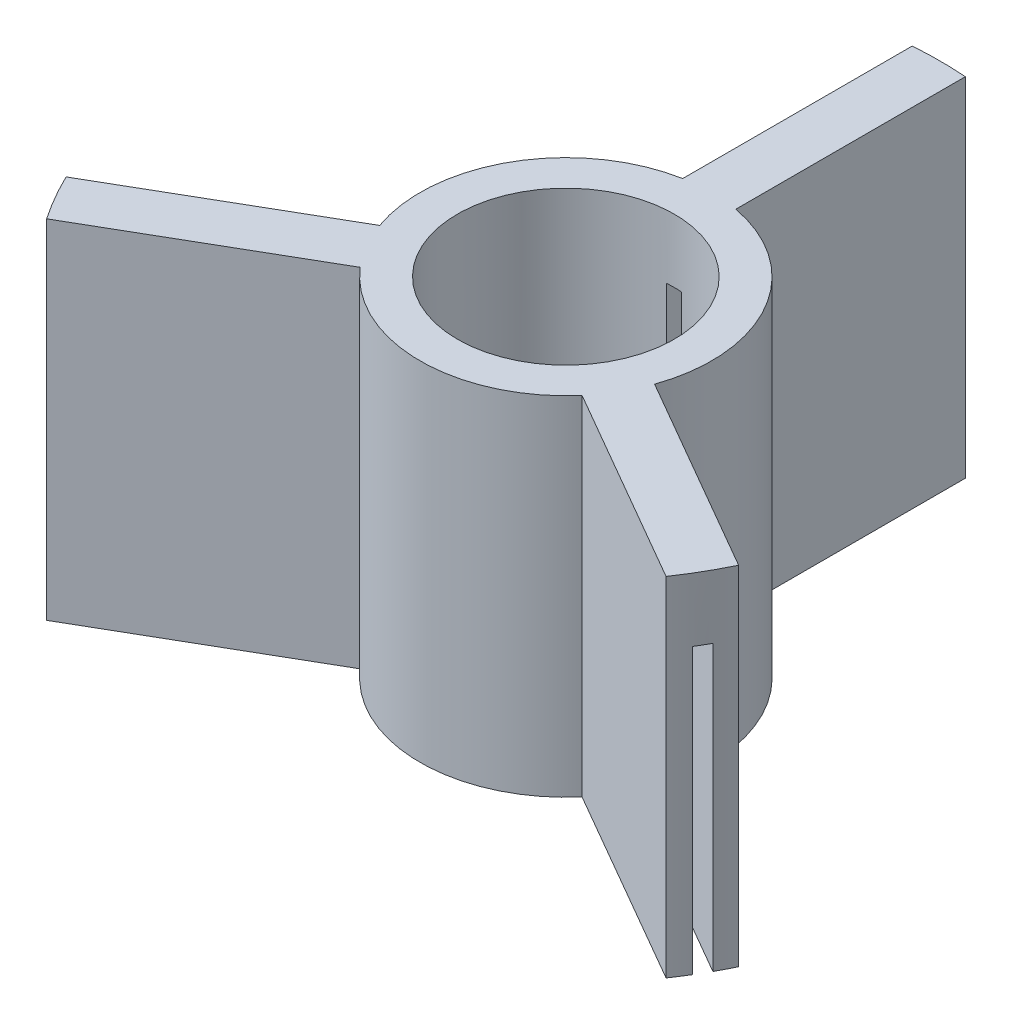
ISO-10303-21;
HEADER;
FILE_DESCRIPTION(('STEP AP214'),'2;1');
FILE_NAME('part.step','',(''),(''),'','','');
FILE_SCHEMA(('AUTOMOTIVE_DESIGN { 1 0 10303 214 1 1 1 1 }'));
ENDSEC;
DATA;
#1=APPLICATION_CONTEXT('core data for automotive mechanical design processes');
#2=APPLICATION_PROTOCOL_DEFINITION('international standard','automotive_design',2000,#1);
#3=PRODUCT_CONTEXT('',#1,'mechanical');
#4=PRODUCT('Part','Part','',(#3));
#5=PRODUCT_RELATED_PRODUCT_CATEGORY('part','',(#4));
#6=PRODUCT_DEFINITION_FORMATION('','',#4);
#7=PRODUCT_DEFINITION_CONTEXT('part definition',#1,'design');
#8=PRODUCT_DEFINITION('design','',#6,#7);
#9=PRODUCT_DEFINITION_SHAPE('','',#8);
#10=(LENGTH_UNIT() NAMED_UNIT(*) SI_UNIT(.MILLI.,.METRE.));
#11=(NAMED_UNIT(*) PLANE_ANGLE_UNIT() SI_UNIT($,.RADIAN.));
#12=(NAMED_UNIT(*) SI_UNIT($,.STERADIAN.) SOLID_ANGLE_UNIT());
#13=UNCERTAINTY_MEASURE_WITH_UNIT(LENGTH_MEASURE(1.E-05),#10,'distance_accuracy_value','');
#14=(GEOMETRIC_REPRESENTATION_CONTEXT(3) GLOBAL_UNCERTAINTY_ASSIGNED_CONTEXT((#13)) GLOBAL_UNIT_ASSIGNED_CONTEXT((#10,
#11,#12)) REPRESENTATION_CONTEXT('',''));
#15=CARTESIAN_POINT('',(0.,0.,0.));
#16=DIRECTION('',(0.,0.,1.));
#17=DIRECTION('',(1.,0.,0.));
#18=AXIS2_PLACEMENT_3D('',#15,#16,#17);
#19=CARTESIAN_POINT('',(0.,93.0000000000001,0.));
#20=DIRECTION('',(0.,-1.,0.));
#21=DIRECTION('',(0.,0.,-1.));
#22=AXIS2_PLACEMENT_3D('',#19,#20,#21);
#23=CYLINDRICAL_SURFACE('',#22,29.);
#24=CARTESIAN_POINT('',(0.,93.0000000000001,0.));
#25=DIRECTION('',(0.,1.,0.));
#26=DIRECTION('',(0.,0.,1.));
#27=AXIS2_PLACEMENT_3D('',#24,#25,#26);
#28=CIRCLE('',#27,29.);
#29=CARTESIAN_POINT('',(0.,93.0000000000001,29.));
#30=VERTEX_POINT('',#29);
#31=EDGE_CURVE('E331',#30,#30,#28,.T.);
#32=ORIENTED_EDGE('',*,*,#31,.T.);
#33=EDGE_LOOP('',(#32));
#34=FACE_BOUND('',#33,.T.);
#35=CARTESIAN_POINT('',(0.,76.0000000000001,0.));
#36=DIRECTION('',(0.,-1.,0.));
#37=DIRECTION('',(0.,0.,-1.));
#38=AXIS2_PLACEMENT_3D('',#35,#36,#37);
#39=CIRCLE('',#38,29.);
#40=CARTESIAN_POINT('',(26.0549396327351,76.0000000000001,12.7334253339205));
#41=VERTEX_POINT('',#40);
#42=CARTESIAN_POINT('',(24.0549396327351,76.0000000000001,16.1975269490583));
#43=VERTEX_POINT('',#42);
#44=EDGE_CURVE('E515',#41,#43,#39,.T.);
#45=ORIENTED_EDGE('',*,*,#44,.T.);
#46=DIRECTION('',(0.,-1.,0.));
#47=VECTOR('',#46,1.);
#48=CARTESIAN_POINT('',(24.0549396327351,93.0000000000001,16.1975269490583));
#49=LINE('',#48,#47);
#50=CARTESIAN_POINT('',(24.0549396327351,0.,16.1975269490583));
#51=VERTEX_POINT('',#50);
#52=EDGE_CURVE('E519',#43,#51,#49,.T.);
#53=ORIENTED_EDGE('',*,*,#52,.T.);
#54=CARTESIAN_POINT('',(0.,0.,0.));
#55=DIRECTION('',(0.,1.,0.));
#56=DIRECTION('',(0.,0.,1.));
#57=AXIS2_PLACEMENT_3D('',#54,#55,#56);
#58=CIRCLE('',#57,29.);
#59=CARTESIAN_POINT('',(-24.0549396327351,0.,16.1975269490583));
#60=VERTEX_POINT('',#59);
#61=EDGE_CURVE('E308',#60,#51,#58,.T.);
#62=ORIENTED_EDGE('',*,*,#61,.F.);
#63=DIRECTION('',(0.,-1.,0.));
#64=VECTOR('',#63,1.);
#65=CARTESIAN_POINT('',(-24.0549396327351,93.0000000000001,16.1975269490583));
#66=LINE('',#65,#64);
#67=CARTESIAN_POINT('',(-24.0549396327351,76.0000000000001,16.1975269490583));
#68=VERTEX_POINT('',#67);
#69=EDGE_CURVE('E134',#68,#60,#66,.T.);
#70=ORIENTED_EDGE('',*,*,#69,.F.);
#71=CARTESIAN_POINT('',(-26.0549396327351,76.0000000000001,12.7334253339206));
#72=VERTEX_POINT('',#71);
#73=EDGE_CURVE('E514',#68,#72,#39,.T.);
#74=ORIENTED_EDGE('',*,*,#73,.T.);
#75=DIRECTION('',(0.,-1.,0.));
#76=VECTOR('',#75,1.);
#77=CARTESIAN_POINT('',(-26.0549396327351,93.0000000000001,12.7334253339206));
#78=LINE('',#77,#76);
#79=CARTESIAN_POINT('',(-26.0549396327351,0.,12.7334253339206));
#80=VERTEX_POINT('',#79);
#81=EDGE_CURVE('E305',#72,#80,#78,.T.);
#82=ORIENTED_EDGE('',*,*,#81,.T.);
#83=CARTESIAN_POINT('',(-2.,0.,-28.9309522829789));
#84=VERTEX_POINT('',#83);
#85=EDGE_CURVE('E295',#84,#80,#58,.T.);
#86=ORIENTED_EDGE('',*,*,#85,.F.);
#87=DIRECTION('',(0.,-1.,0.));
#88=VECTOR('',#87,1.);
#89=CARTESIAN_POINT('',(-2.,93.0000000000001,-28.9309522829789));
#90=LINE('',#89,#88);
#91=CARTESIAN_POINT('',(-2.,76.0000000000001,-28.9309522829789));
#92=VERTEX_POINT('',#91);
#93=EDGE_CURVE('E279',#92,#84,#90,.T.);
#94=ORIENTED_EDGE('',*,*,#93,.F.);
#95=CARTESIAN_POINT('',(2.,76.0000000000001,-28.9309522829789));
#96=VERTEX_POINT('',#95);
#97=EDGE_CURVE('E511',#92,#96,#39,.T.);
#98=ORIENTED_EDGE('',*,*,#97,.T.);
#99=DIRECTION('',(0.,-1.,0.));
#100=VECTOR('',#99,1.);
#101=CARTESIAN_POINT('',(2.,93.0000000000001,-28.9309522829789));
#102=LINE('',#101,#100);
#103=CARTESIAN_POINT('',(2.,0.,-28.9309522829789));
#104=VERTEX_POINT('',#103);
#105=EDGE_CURVE('E287',#96,#104,#102,.T.);
#106=ORIENTED_EDGE('',*,*,#105,.T.);
#107=CARTESIAN_POINT('',(26.0549396327351,0.,12.7334253339205));
#108=VERTEX_POINT('',#107);
#109=EDGE_CURVE('E307',#108,#104,#58,.T.);
#110=ORIENTED_EDGE('',*,*,#109,.F.);
#111=DIRECTION('',(0.,-1.,0.));
#112=VECTOR('',#111,1.);
#113=CARTESIAN_POINT('',(26.0549396327351,93.0000000000001,12.7334253339205));
#114=LINE('',#113,#112);
#115=EDGE_CURVE('E516',#41,#108,#114,.T.);
#116=ORIENTED_EDGE('',*,*,#115,.F.);
#117=EDGE_LOOP('',(#45,#53,#62,#70,#74,#82,#86,#94,#98,#106,#110,#116));
#118=FACE_BOUND('',#117,.T.);
#119=ADVANCED_FACE('F119',(#34,#118),#23,.F.);
#120=CARTESIAN_POINT('',(0.,93.0000000000001,0.));
#121=DIRECTION('',(0.,-1.,0.));
#122=DIRECTION('',(0.,0.,-1.));
#123=AXIS2_PLACEMENT_3D('',#120,#121,#122);
#124=CYLINDRICAL_SURFACE('',#123,100.);
#125=DIRECTION('',(0.,-1.,0.));
#126=VECTOR('',#125,1.);
#127=CARTESIAN_POINT('',(-87.5852181379709,93.0000000000001,48.2579481922311));
#128=LINE('',#127,#126);
#129=CARTESIAN_POINT('',(-87.5852181379709,76.0000000000001,48.2579481922311));
#130=VERTEX_POINT('',#129);
#131=CARTESIAN_POINT('',(-87.5852181379709,0.,48.2579481922311));
#132=VERTEX_POINT('',#131);
#133=EDGE_CURVE('E528',#130,#132,#128,.T.);
#134=ORIENTED_EDGE('',*,*,#133,.F.);
#135=CARTESIAN_POINT('',(0.,76.0000000000001,0.));
#136=DIRECTION('',(0.,-1.,0.));
#137=DIRECTION('',(0.,0.,-1.));
#138=AXIS2_PLACEMENT_3D('',#135,#136,#137);
#139=CIRCLE('',#138,100.);
#140=CARTESIAN_POINT('',(-85.5852181379709,76.0000000000001,51.7220498073689));
#141=VERTEX_POINT('',#140);
#142=EDGE_CURVE('E508',#141,#130,#139,.T.);
#143=ORIENTED_EDGE('',*,*,#142,.F.);
#144=DIRECTION('',(0.,-1.,0.));
#145=VECTOR('',#144,1.);
#146=CARTESIAN_POINT('',(-85.5852181379708,93.0000000000001,51.7220498073689));
#147=LINE('',#146,#145);
#148=CARTESIAN_POINT('',(-85.5852181379709,0.,51.7220498073689));
#149=VERTEX_POINT('',#148);
#150=EDGE_CURVE('E522',#141,#149,#147,.T.);
#151=ORIENTED_EDGE('',*,*,#150,.T.);
#152=CARTESIAN_POINT('',(0.,0.,0.));
#153=DIRECTION('',(0.,1.,0.));
#154=DIRECTION('',(0.,0.,1.));
#155=AXIS2_PLACEMENT_3D('',#152,#153,#154);
#156=CIRCLE('',#155,100.);
#157=CARTESIAN_POINT('',(-82.832517720387,0.,56.0247624546663));
#158=VERTEX_POINT('',#157);
#159=EDGE_CURVE('E322',#149,#158,#156,.T.);
#160=ORIENTED_EDGE('',*,*,#159,.T.);
#161=DIRECTION('',(0.,-1.,0.));
#162=VECTOR('',#161,1.);
#163=CARTESIAN_POINT('',(-82.832517720387,93.0000000000001,56.0247624546663));
#164=LINE('',#163,#162);
#165=CARTESIAN_POINT('',(-82.832517720387,93.0000000000001,56.0247624546663));
#166=VERTEX_POINT('',#165);
#167=EDGE_CURVE('E332',#166,#158,#164,.T.);
#168=ORIENTED_EDGE('',*,*,#167,.F.);
#169=CARTESIAN_POINT('',(0.,93.0000000000001,0.));
#170=DIRECTION('',(0.,1.,0.));
#171=DIRECTION('',(0.,0.,1.));
#172=AXIS2_PLACEMENT_3D('',#169,#170,#171);
#173=CIRCLE('',#172,100.);
#174=CARTESIAN_POINT('',(-89.9351263869235,93.0000000000001,43.7226833779459));
#175=VERTEX_POINT('',#174);
#176=EDGE_CURVE('E431',#175,#166,#173,.T.);
#177=ORIENTED_EDGE('',*,*,#176,.F.);
#178=DIRECTION('',(0.,-1.,0.));
#179=VECTOR('',#178,1.);
#180=CARTESIAN_POINT('',(-89.9351263869235,93.0000000000001,43.7226833779459));
#181=LINE('',#180,#179);
#182=CARTESIAN_POINT('',(-89.9351263869235,0.,43.7226833779459));
#183=VERTEX_POINT('',#182);
#184=EDGE_CURVE('E336',#175,#183,#181,.T.);
#185=ORIENTED_EDGE('',*,*,#184,.T.);
#186=EDGE_CURVE('E323',#183,#132,#156,.T.);
#187=ORIENTED_EDGE('',*,*,#186,.T.);
#188=EDGE_LOOP('',(#134,#143,#151,#160,#168,#177,#185,#187));
#189=FACE_BOUND('',#188,.T.);
#190=ADVANCED_FACE('F596',(#189),#124,.T.);
#191=CARTESIAN_POINT('',(0.,0.,0.));
#192=DIRECTION('',(0.,1.,0.));
#193=DIRECTION('',(0.,0.,1.));
#194=AXIS2_PLACEMENT_3D('',#191,#192,#193);
#195=PLANE('',#194);
#196=DIRECTION('',(0.866025403784439,0.,0.5));
#197=VECTOR('',#196,1.);
#198=CARTESIAN_POINT('',(-1.,0.,1.73205080756888));
#199=LINE('',#198,#197);
#200=CARTESIAN_POINT('',(85.5852181379709,0.,51.7220498073688));
#201=VERTEX_POINT('',#200);
#202=EDGE_CURVE('E469',#51,#201,#199,.T.);
#203=ORIENTED_EDGE('',*,*,#202,.T.);
#204=CARTESIAN_POINT('',(0.,0.,0.));
#205=DIRECTION('',(0.,1.,0.));
#206=DIRECTION('',(0.,0.,1.));
#207=AXIS2_PLACEMENT_3D('',#204,#205,#206);
#208=CIRCLE('',#207,100.);
#209=CARTESIAN_POINT('',(82.8325177203867,0.,56.0247624546666));
#210=VERTEX_POINT('',#209);
#211=EDGE_CURVE('E387',#210,#201,#208,.T.);
#212=ORIENTED_EDGE('',*,*,#211,.F.);
#213=DIRECTION('',(0.866025403784439,0.,0.5));
#214=VECTOR('',#213,1.);
#215=CARTESIAN_POINT('',(-3.55130433326828,0.,6.15103953836017));
#216=LINE('',#215,#214);
#217=CARTESIAN_POINT('',(29.6588554464969,0.,25.3249342270381));
#218=VERTEX_POINT('',#217);
#219=EDGE_CURVE('E388',#218,#210,#216,.T.);
#220=ORIENTED_EDGE('',*,*,#219,.F.);
#221=CARTESIAN_POINT('',(0.,0.,0.));
#222=DIRECTION('',(0.,1.,0.));
#223=DIRECTION('',(1.,0.,0.));
#224=AXIS2_PLACEMENT_3D('',#221,#222,#223);
#225=CIRCLE('',#224,39.);
#226=CARTESIAN_POINT('',(-29.658855446497,0.,25.3249342270379));
#227=VERTEX_POINT('',#226);
#228=EDGE_CURVE('E416',#227,#218,#225,.T.);
#229=ORIENTED_EDGE('',*,*,#228,.F.);
#230=DIRECTION('',(-0.866025403784441,0.,0.499999999999996));
#231=VECTOR('',#230,1.);
#232=CARTESIAN_POINT('',(3.55130433326826,0.,6.1510395383602));
#233=LINE('',#232,#231);
#234=EDGE_CURVE('E327',#227,#158,#233,.T.);
#235=ORIENTED_EDGE('',*,*,#234,.T.);
#236=ORIENTED_EDGE('',*,*,#159,.F.);
#237=DIRECTION('',(-0.866025403784438,0.,0.5));
#238=VECTOR('',#237,1.);
#239=CARTESIAN_POINT('',(1.,0.,1.73205080756888));
#240=LINE('',#239,#238);
#241=EDGE_CURVE('E494',#60,#149,#240,.T.);
#242=ORIENTED_EDGE('',*,*,#241,.F.);
#243=ORIENTED_EDGE('',*,*,#61,.T.);
#244=EDGE_LOOP('',(#203,#212,#220,#229,#235,#236,#242,#243));
#245=FACE_BOUND('',#244,.T.);
#246=ADVANCED_FACE('F467',(#245),#195,.F.);
#247=CARTESIAN_POINT('',(87.5852181379709,0.,48.2579481922311));
#248=VERTEX_POINT('',#247);
#249=CARTESIAN_POINT('',(89.9351263869233,0.,43.7226833779463));
#250=VERTEX_POINT('',#249);
#251=EDGE_CURVE('E372',#248,#250,#208,.T.);
#252=ORIENTED_EDGE('',*,*,#251,.F.);
#253=DIRECTION('',(0.866025403784439,0.,0.5));
#254=VECTOR('',#253,1.);
#255=CARTESIAN_POINT('',(1.,0.,-1.73205080756888));
#256=LINE('',#255,#254);
#257=EDGE_CURVE('E381',#108,#248,#256,.T.);
#258=ORIENTED_EDGE('',*,*,#257,.F.);
#259=ORIENTED_EDGE('',*,*,#109,.T.);
#260=DIRECTION('',(0.,0.,-1.));
#261=VECTOR('',#260,1.);
#262=CARTESIAN_POINT('',(2.,0.,0.));
#263=LINE('',#262,#261);
#264=CARTESIAN_POINT('',(2.,0.,-99.9799979995999));
#265=VERTEX_POINT('',#264);
#266=EDGE_CURVE('E300',#104,#265,#263,.T.);
#267=ORIENTED_EDGE('',*,*,#266,.T.);
#268=CARTESIAN_POINT('',(0.,0.,0.));
#269=DIRECTION('',(0.,1.,0.));
#270=DIRECTION('',(0.,0.,1.));
#271=AXIS2_PLACEMENT_3D('',#268,#269,#270);
#272=CIRCLE('',#271,100.);
#273=CARTESIAN_POINT('',(7.10260866653747,0.,-99.7474458326128));
#274=VERTEX_POINT('',#273);
#275=EDGE_CURVE('E548',#274,#265,#272,.T.);
#276=ORIENTED_EDGE('',*,*,#275,.F.);
#277=DIRECTION('',(0.,0.,-1.));
#278=VECTOR('',#277,1.);
#279=CARTESIAN_POINT('',(7.10260866653655,0.,0.));
#280=LINE('',#279,#278);
#281=CARTESIAN_POINT('',(7.1026086665369,0.,-38.3477893773557));
#282=VERTEX_POINT('',#281);
#283=EDGE_CURVE('E533',#282,#274,#280,.T.);
#284=ORIENTED_EDGE('',*,*,#283,.F.);
#285=CARTESIAN_POINT('',(36.7614641130334,0.,13.0228551503177));
#286=VERTEX_POINT('',#285);
#287=EDGE_CURVE('E419',#286,#282,#225,.T.);
#288=ORIENTED_EDGE('',*,*,#287,.F.);
#289=DIRECTION('',(0.866025403784439,0.,0.5));
#290=VECTOR('',#289,1.);
#291=CARTESIAN_POINT('',(3.55130433326828,0.,-6.15103953836018));
#292=LINE('',#291,#290);
#293=EDGE_CURVE('E384',#286,#250,#292,.T.);
#294=ORIENTED_EDGE('',*,*,#293,.T.);
#295=EDGE_LOOP('',(#252,#258,#259,#267,#276,#284,#288,#294));
#296=FACE_BOUND('',#295,.T.);
#297=ADVANCED_FACE('F380',(#296),#195,.F.);
#298=CARTESIAN_POINT('',(-2.,0.,-99.9799979995999));
#299=VERTEX_POINT('',#298);
#300=CARTESIAN_POINT('',(-7.10260866653565,0.,-99.7474458326129));
#301=VERTEX_POINT('',#300);
#302=EDGE_CURVE('E297',#299,#301,#272,.T.);
#303=ORIENTED_EDGE('',*,*,#302,.F.);
#304=DIRECTION('',(0.,0.,-1.));
#305=VECTOR('',#304,1.);
#306=CARTESIAN_POINT('',(-2.,0.,0.));
#307=LINE('',#306,#305);
#308=EDGE_CURVE('E142',#84,#299,#307,.T.);
#309=ORIENTED_EDGE('',*,*,#308,.F.);
#310=ORIENTED_EDGE('',*,*,#85,.T.);
#311=DIRECTION('',(-0.866025403784438,0.,0.5));
#312=VECTOR('',#311,1.);
#313=CARTESIAN_POINT('',(-1.,0.,-1.73205080756888));
#314=LINE('',#313,#312);
#315=EDGE_CURVE('E498',#80,#132,#314,.T.);
#316=ORIENTED_EDGE('',*,*,#315,.T.);
#317=ORIENTED_EDGE('',*,*,#186,.F.);
#318=DIRECTION('',(-0.866025403784441,0.,0.499999999999996));
#319=VECTOR('',#318,1.);
#320=CARTESIAN_POINT('',(-3.55130433326825,0.,-6.15103953836018));
#321=LINE('',#320,#319);
#322=CARTESIAN_POINT('',(-36.7614641130335,0.,13.0228551503176));
#323=VERTEX_POINT('',#322);
#324=EDGE_CURVE('E313',#323,#183,#321,.T.);
#325=ORIENTED_EDGE('',*,*,#324,.F.);
#326=CARTESIAN_POINT('',(-7.10260866653621,0.,-38.3477893773558));
#327=VERTEX_POINT('',#326);
#328=EDGE_CURVE('E408',#327,#323,#225,.T.);
#329=ORIENTED_EDGE('',*,*,#328,.F.);
#330=DIRECTION('',(0.,0.,-1.));
#331=VECTOR('',#330,1.);
#332=CARTESIAN_POINT('',(-7.10260866653656,0.,0.));
#333=LINE('',#332,#331);
#334=EDGE_CURVE('E538',#327,#301,#333,.T.);
#335=ORIENTED_EDGE('',*,*,#334,.T.);
#336=EDGE_LOOP('',(#303,#309,#310,#316,#317,#325,#329,#335));
#337=FACE_BOUND('',#336,.T.);
#338=ADVANCED_FACE('F293',(#337),#195,.F.);
#339=CARTESIAN_POINT('',(0.,93.0000000000001,0.));
#340=DIRECTION('',(0.,-1.,0.));
#341=DIRECTION('',(0.,0.,-1.));
#342=AXIS2_PLACEMENT_3D('',#339,#340,#341);
#343=CYLINDRICAL_SURFACE('',#342,100.);
#344=DIRECTION('',(0.,-1.,0.));
#345=VECTOR('',#344,1.);
#346=CARTESIAN_POINT('',(85.5852181379709,93.0000000000001,51.7220498073688));
#347=LINE('',#346,#345);
#348=CARTESIAN_POINT('',(85.5852181379709,76.0000000000001,51.7220498073688));
#349=VERTEX_POINT('',#348);
#350=EDGE_CURVE('E12',#349,#201,#347,.T.);
#351=ORIENTED_EDGE('',*,*,#350,.F.);
#352=CARTESIAN_POINT('',(0.,76.0000000000001,0.));
#353=DIRECTION('',(0.,-1.,0.));
#354=DIRECTION('',(0.,0.,-1.));
#355=AXIS2_PLACEMENT_3D('',#352,#353,#354);
#356=CIRCLE('',#355,100.);
#357=CARTESIAN_POINT('',(87.5852181379709,76.0000000000001,48.2579481922311));
#358=VERTEX_POINT('',#357);
#359=EDGE_CURVE('E374',#358,#349,#356,.T.);
#360=ORIENTED_EDGE('',*,*,#359,.F.);
#361=DIRECTION('',(0.,-1.,0.));
#362=VECTOR('',#361,1.);
#363=CARTESIAN_POINT('',(87.5852181379709,93.0000000000001,48.2579481922311));
#364=LINE('',#363,#362);
#365=EDGE_CURVE('E127',#358,#248,#364,.T.);
#366=ORIENTED_EDGE('',*,*,#365,.T.);
#367=ORIENTED_EDGE('',*,*,#251,.T.);
#368=DIRECTION('',(0.,-1.,0.));
#369=VECTOR('',#368,1.);
#370=CARTESIAN_POINT('',(89.9351263869233,93.0000000000001,43.7226833779463));
#371=LINE('',#370,#369);
#372=CARTESIAN_POINT('',(89.9351263869233,93.0000000000001,43.7226833779463));
#373=VERTEX_POINT('',#372);
#374=EDGE_CURVE('E400',#373,#250,#371,.T.);
#375=ORIENTED_EDGE('',*,*,#374,.F.);
#376=CARTESIAN_POINT('',(0.,93.0000000000001,0.));
#377=DIRECTION('',(0.,1.,0.));
#378=DIRECTION('',(0.,0.,1.));
#379=AXIS2_PLACEMENT_3D('',#376,#377,#378);
#380=CIRCLE('',#379,100.);
#381=CARTESIAN_POINT('',(82.8325177203867,93.0000000000001,56.0247624546666));
#382=VERTEX_POINT('',#381);
#383=EDGE_CURVE('E453',#382,#373,#380,.T.);
#384=ORIENTED_EDGE('',*,*,#383,.F.);
#385=DIRECTION('',(0.,-1.,0.));
#386=VECTOR('',#385,1.);
#387=CARTESIAN_POINT('',(82.8325177203867,93.0000000000001,56.0247624546666));
#388=LINE('',#387,#386);
#389=EDGE_CURVE('E403',#382,#210,#388,.T.);
#390=ORIENTED_EDGE('',*,*,#389,.T.);
#391=ORIENTED_EDGE('',*,*,#211,.T.);
#392=EDGE_LOOP('',(#351,#360,#366,#367,#375,#384,#390,#391));
#393=FACE_BOUND('',#392,.T.);
#394=ADVANCED_FACE('F370',(#393),#343,.T.);
#395=CARTESIAN_POINT('',(0.,93.0000000000001,0.));
#396=DIRECTION('',(0.,-1.,0.));
#397=DIRECTION('',(0.,0.,-1.));
#398=AXIS2_PLACEMENT_3D('',#395,#396,#397);
#399=CYLINDRICAL_SURFACE('',#398,100.);
#400=DIRECTION('',(0.,-1.,0.));
#401=VECTOR('',#400,1.);
#402=CARTESIAN_POINT('',(2.,93.0000000000001,-99.9799979995999));
#403=LINE('',#402,#401);
#404=CARTESIAN_POINT('',(2.,76.0000000000001,-99.9799979995999));
#405=VERTEX_POINT('',#404);
#406=EDGE_CURVE('E362',#405,#265,#403,.T.);
#407=ORIENTED_EDGE('',*,*,#406,.F.);
#408=CARTESIAN_POINT('',(0.,76.0000000000001,0.));
#409=DIRECTION('',(0.,-1.,0.));
#410=DIRECTION('',(0.,0.,-1.));
#411=AXIS2_PLACEMENT_3D('',#408,#409,#410);
#412=CIRCLE('',#411,100.);
#413=CARTESIAN_POINT('',(-2.,76.0000000000001,-99.9799979995999));
#414=VERTEX_POINT('',#413);
#415=EDGE_CURVE('E359',#414,#405,#412,.T.);
#416=ORIENTED_EDGE('',*,*,#415,.F.);
#417=DIRECTION('',(0.,-1.,0.));
#418=VECTOR('',#417,1.);
#419=CARTESIAN_POINT('',(-2.,93.0000000000001,-99.9799979995999));
#420=LINE('',#419,#418);
#421=EDGE_CURVE('E356',#414,#299,#420,.T.);
#422=ORIENTED_EDGE('',*,*,#421,.T.);
#423=ORIENTED_EDGE('',*,*,#302,.T.);
#424=DIRECTION('',(0.,-1.,0.));
#425=VECTOR('',#424,1.);
#426=CARTESIAN_POINT('',(-7.10260866653565,93.0000000000001,-99.7474458326129));
#427=LINE('',#426,#425);
#428=CARTESIAN_POINT('',(-7.10260866653565,93.0000000000001,-99.7474458326129));
#429=VERTEX_POINT('',#428);
#430=EDGE_CURVE('E545',#429,#301,#427,.T.);
#431=ORIENTED_EDGE('',*,*,#430,.F.);
#432=CARTESIAN_POINT('',(0.,93.0000000000001,0.));
#433=DIRECTION('',(0.,1.,0.));
#434=DIRECTION('',(0.,0.,1.));
#435=AXIS2_PLACEMENT_3D('',#432,#433,#434);
#436=CIRCLE('',#435,100.);
#437=CARTESIAN_POINT('',(7.10260866653747,93.0000000000001,-99.7474458326128));
#438=VERTEX_POINT('',#437);
#439=EDGE_CURVE('E537',#438,#429,#436,.T.);
#440=ORIENTED_EDGE('',*,*,#439,.F.);
#441=DIRECTION('',(0.,-1.,0.));
#442=VECTOR('',#441,1.);
#443=CARTESIAN_POINT('',(7.10260866653747,93.0000000000001,-99.7474458326128));
#444=LINE('',#443,#442);
#445=EDGE_CURVE('E393',#438,#274,#444,.T.);
#446=ORIENTED_EDGE('',*,*,#445,.T.);
#447=ORIENTED_EDGE('',*,*,#275,.T.);
#448=EDGE_LOOP('',(#407,#416,#422,#423,#431,#440,#446,#447));
#449=FACE_BOUND('',#448,.T.);
#450=ADVANCED_FACE('F565',(#449),#399,.T.);
#451=CARTESIAN_POINT('',(0.,93.0000000000001,0.));
#452=DIRECTION('',(0.,-1.,0.));
#453=DIRECTION('',(0.,0.,-1.));
#454=AXIS2_PLACEMENT_3D('',#451,#452,#453);
#455=CYLINDRICAL_SURFACE('',#454,39.);
#456=DIRECTION('',(0.,-1.,0.));
#457=VECTOR('',#456,1.);
#458=CARTESIAN_POINT('',(7.10260866653691,93.0000000000001,-38.3477893773557));
#459=LINE('',#458,#457);
#460=CARTESIAN_POINT('',(7.1026086665369,93.0000000000001,-38.3477893773557));
#461=VERTEX_POINT('',#460);
#462=EDGE_CURVE('E352',#461,#282,#459,.T.);
#463=ORIENTED_EDGE('',*,*,#462,.F.);
#464=CARTESIAN_POINT('',(0.,93.0000000000001,0.));
#465=DIRECTION('',(0.,1.,0.));
#466=DIRECTION('',(1.,0.,0.));
#467=AXIS2_PLACEMENT_3D('',#464,#465,#466);
#468=CIRCLE('',#467,39.);
#469=CARTESIAN_POINT('',(36.7614641130334,93.0000000000001,13.0228551503177));
#470=VERTEX_POINT('',#469);
#471=EDGE_CURVE('E414',#470,#461,#468,.T.);
#472=ORIENTED_EDGE('',*,*,#471,.F.);
#473=DIRECTION('',(0.,-1.,0.));
#474=VECTOR('',#473,1.);
#475=CARTESIAN_POINT('',(36.7614641130334,93.0000000000001,13.0228551503177));
#476=LINE('',#475,#474);
#477=EDGE_CURVE('E340',#470,#286,#476,.T.);
#478=ORIENTED_EDGE('',*,*,#477,.T.);
#479=ORIENTED_EDGE('',*,*,#287,.T.);
#480=EDGE_LOOP('',(#463,#472,#478,#479));
#481=FACE_BOUND('',#480,.T.);
#482=ADVANCED_FACE('F585',(#481),#455,.T.);
#483=DIRECTION('',(0.,-1.,0.));
#484=VECTOR('',#483,1.);
#485=CARTESIAN_POINT('',(29.6588554464969,93.0000000000001,25.324934227038));
#486=LINE('',#485,#484);
#487=CARTESIAN_POINT('',(29.6588554464969,93.0000000000001,25.3249342270381));
#488=VERTEX_POINT('',#487);
#489=EDGE_CURVE('E344',#488,#218,#486,.T.);
#490=ORIENTED_EDGE('',*,*,#489,.F.);
#491=CARTESIAN_POINT('',(-29.658855446497,93.0000000000001,25.3249342270379));
#492=VERTEX_POINT('',#491);
#493=EDGE_CURVE('E409',#492,#488,#468,.T.);
#494=ORIENTED_EDGE('',*,*,#493,.F.);
#495=DIRECTION('',(0.,-1.,0.));
#496=VECTOR('',#495,1.);
#497=CARTESIAN_POINT('',(-29.658855446497,93.0000000000001,25.3249342270379));
#498=LINE('',#497,#496);
#499=EDGE_CURVE('E413',#227,#492,#498,.F.);
#500=ORIENTED_EDGE('',*,*,#499,.F.);
#501=ORIENTED_EDGE('',*,*,#228,.T.);
#502=EDGE_LOOP('',(#490,#494,#500,#501));
#503=FACE_BOUND('',#502,.T.);
#504=ADVANCED_FACE('F600',(#503),#455,.T.);
#505=CARTESIAN_POINT('',(-3.55130433326825,93.0000000000001,-6.15103953836018));
#506=DIRECTION('',(0.499999999999996,0.,0.866025403784441));
#507=DIRECTION('',(0.866025403784441,0.,-0.499999999999996));
#508=AXIS2_PLACEMENT_3D('',#505,#506,#507);
#509=PLANE('',#508);
#510=DIRECTION('',(0.,-1.,0.));
#511=VECTOR('',#510,1.);
#512=CARTESIAN_POINT('',(-36.7614641130335,93.0000000000001,13.0228551503176));
#513=LINE('',#512,#511);
#514=CARTESIAN_POINT('',(-36.7614641130335,93.0000000000001,13.0228551503176));
#515=VERTEX_POINT('',#514);
#516=EDGE_CURVE('E315',#323,#515,#513,.F.);
#517=ORIENTED_EDGE('',*,*,#516,.F.);
#518=ORIENTED_EDGE('',*,*,#324,.T.);
#519=ORIENTED_EDGE('',*,*,#184,.F.);
#520=DIRECTION('',(-0.866025403784441,0.,0.499999999999996));
#521=VECTOR('',#520,1.);
#522=CARTESIAN_POINT('',(-3.55130433326825,93.0000000000001,-6.15103953836018));
#523=LINE('',#522,#521);
#524=EDGE_CURVE('E429',#515,#175,#523,.T.);
#525=ORIENTED_EDGE('',*,*,#524,.F.);
#526=EDGE_LOOP('',(#517,#518,#519,#525));
#527=FACE_BOUND('',#526,.T.);
#528=ADVANCED_FACE('F591',(#527),#509,.F.);
#529=CARTESIAN_POINT('',(3.55130433326826,93.0000000000001,6.1510395383602));
#530=DIRECTION('',(0.499999999999996,0.,0.866025403784441));
#531=DIRECTION('',(0.866025403784441,0.,-0.499999999999996));
#532=AXIS2_PLACEMENT_3D('',#529,#530,#531);
#533=PLANE('',#532);
#534=ORIENTED_EDGE('',*,*,#234,.F.);
#535=ORIENTED_EDGE('',*,*,#499,.T.);
#536=DIRECTION('',(-0.866025403784441,0.,0.499999999999996));
#537=VECTOR('',#536,1.);
#538=CARTESIAN_POINT('',(3.55130433326826,93.0000000000001,6.1510395383602));
#539=LINE('',#538,#537);
#540=EDGE_CURVE('E318',#492,#166,#539,.T.);
#541=ORIENTED_EDGE('',*,*,#540,.T.);
#542=ORIENTED_EDGE('',*,*,#167,.T.);
#543=EDGE_LOOP('',(#534,#535,#541,#542));
#544=FACE_BOUND('',#543,.T.);
#545=ADVANCED_FACE('F441',(#544),#533,.T.);
#546=CARTESIAN_POINT('',(0.,93.0000000000001,0.));
#547=DIRECTION('',(0.,1.,0.));
#548=DIRECTION('',(0.,0.,1.));
#549=AXIS2_PLACEMENT_3D('',#546,#547,#548);
#550=PLANE('',#549);
#551=ORIENTED_EDGE('',*,*,#31,.F.);
#552=EDGE_LOOP('',(#551));
#553=FACE_BOUND('',#552,.T.);
#554=ORIENTED_EDGE('',*,*,#471,.T.);
#555=DIRECTION('',(0.,0.,-1.));
#556=VECTOR('',#555,1.);
#557=CARTESIAN_POINT('',(7.10260866653655,93.0000000000001,0.));
#558=LINE('',#557,#556);
#559=EDGE_CURVE('E534',#461,#438,#558,.T.);
#560=ORIENTED_EDGE('',*,*,#559,.T.);
#561=ORIENTED_EDGE('',*,*,#439,.T.);
#562=DIRECTION('',(0.,0.,-1.));
#563=VECTOR('',#562,1.);
#564=CARTESIAN_POINT('',(-7.10260866653656,93.0000000000001,0.));
#565=LINE('',#564,#563);
#566=CARTESIAN_POINT('',(-7.10260866653621,93.0000000000001,-38.3477893773558));
#567=VERTEX_POINT('',#566);
#568=EDGE_CURVE('E542',#567,#429,#565,.T.);
#569=ORIENTED_EDGE('',*,*,#568,.F.);
#570=EDGE_CURVE('E415',#567,#515,#468,.T.);
#571=ORIENTED_EDGE('',*,*,#570,.T.);
#572=ORIENTED_EDGE('',*,*,#524,.T.);
#573=ORIENTED_EDGE('',*,*,#176,.T.);
#574=ORIENTED_EDGE('',*,*,#540,.F.);
#575=ORIENTED_EDGE('',*,*,#493,.T.);
#576=DIRECTION('',(0.866025403784439,0.,0.5));
#577=VECTOR('',#576,1.);
#578=CARTESIAN_POINT('',(-3.55130433326828,93.0000000000001,6.15103953836017));
#579=LINE('',#578,#577);
#580=EDGE_CURVE('E399',#488,#382,#579,.T.);
#581=ORIENTED_EDGE('',*,*,#580,.T.);
#582=ORIENTED_EDGE('',*,*,#383,.T.);
#583=DIRECTION('',(0.866025403784439,0.,0.5));
#584=VECTOR('',#583,1.);
#585=CARTESIAN_POINT('',(3.55130433326828,93.0000000000001,-6.15103953836018));
#586=LINE('',#585,#584);
#587=EDGE_CURVE('E404',#470,#373,#586,.T.);
#588=ORIENTED_EDGE('',*,*,#587,.F.);
#589=EDGE_LOOP('',(#554,#560,#561,#569,#571,#572,#573,#574,#575,#581,#582,#588));
#590=FACE_BOUND('',#589,.T.);
#591=ADVANCED_FACE('F443',(#553,#590),#550,.T.);
#592=ORIENTED_EDGE('',*,*,#570,.F.);
#593=DIRECTION('',(0.,-1.,0.));
#594=VECTOR('',#593,1.);
#595=CARTESIAN_POINT('',(-7.10260866653621,93.0000000000001,-38.3477893773558));
#596=LINE('',#595,#594);
#597=EDGE_CURVE('E348',#567,#327,#596,.T.);
#598=ORIENTED_EDGE('',*,*,#597,.T.);
#599=ORIENTED_EDGE('',*,*,#328,.T.);
#600=ORIENTED_EDGE('',*,*,#516,.T.);
#601=EDGE_LOOP('',(#592,#598,#599,#600));
#602=FACE_BOUND('',#601,.T.);
#603=ADVANCED_FACE('F589',(#602),#455,.T.);
#604=CARTESIAN_POINT('',(-3.55130433326828,93.0000000000001,6.15103953836017));
#605=DIRECTION('',(0.5,0.,-0.866025403784439));
#606=DIRECTION('',(-0.866025403784439,0.,-0.5));
#607=AXIS2_PLACEMENT_3D('',#604,#605,#606);
#608=PLANE('',#607);
#609=ORIENTED_EDGE('',*,*,#580,.F.);
#610=ORIENTED_EDGE('',*,*,#489,.T.);
#611=ORIENTED_EDGE('',*,*,#219,.T.);
#612=ORIENTED_EDGE('',*,*,#389,.F.);
#613=EDGE_LOOP('',(#609,#610,#611,#612));
#614=FACE_BOUND('',#613,.T.);
#615=ADVANCED_FACE('F449',(#614),#608,.F.);
#616=CARTESIAN_POINT('',(3.55130433326828,93.0000000000001,-6.15103953836018));
#617=DIRECTION('',(0.5,0.,-0.866025403784439));
#618=DIRECTION('',(-0.866025403784439,0.,-0.5));
#619=AXIS2_PLACEMENT_3D('',#616,#617,#618);
#620=PLANE('',#619);
#621=ORIENTED_EDGE('',*,*,#477,.F.);
#622=ORIENTED_EDGE('',*,*,#587,.T.);
#623=ORIENTED_EDGE('',*,*,#374,.T.);
#624=ORIENTED_EDGE('',*,*,#293,.F.);
#625=EDGE_LOOP('',(#621,#622,#623,#624));
#626=FACE_BOUND('',#625,.T.);
#627=ADVANCED_FACE('F463',(#626),#620,.T.);
#628=CARTESIAN_POINT('',(7.10260866653655,93.0000000000001,0.));
#629=DIRECTION('',(-1.,0.,0.));
#630=DIRECTION('',(0.,0.,1.));
#631=AXIS2_PLACEMENT_3D('',#628,#629,#630);
#632=PLANE('',#631);
#633=ORIENTED_EDGE('',*,*,#559,.F.);
#634=ORIENTED_EDGE('',*,*,#462,.T.);
#635=ORIENTED_EDGE('',*,*,#283,.T.);
#636=ORIENTED_EDGE('',*,*,#445,.F.);
#637=EDGE_LOOP('',(#633,#634,#635,#636));
#638=FACE_BOUND('',#637,.T.);
#639=ADVANCED_FACE('F583',(#638),#632,.F.);
#640=CARTESIAN_POINT('',(-7.10260866653656,93.0000000000001,0.));
#641=DIRECTION('',(-1.,0.,0.));
#642=DIRECTION('',(0.,0.,1.));
#643=AXIS2_PLACEMENT_3D('',#640,#641,#642);
#644=PLANE('',#643);
#645=ORIENTED_EDGE('',*,*,#597,.F.);
#646=ORIENTED_EDGE('',*,*,#568,.T.);
#647=ORIENTED_EDGE('',*,*,#430,.T.);
#648=ORIENTED_EDGE('',*,*,#334,.F.);
#649=EDGE_LOOP('',(#645,#646,#647,#648));
#650=FACE_BOUND('',#649,.T.);
#651=ADVANCED_FACE('F579',(#650),#644,.T.);
#652=CARTESIAN_POINT('',(2.,76.0000000000001,0.));
#653=DIRECTION('',(-1.,0.,0.));
#654=DIRECTION('',(0.,0.,1.));
#655=AXIS2_PLACEMENT_3D('',#652,#653,#654);
#656=PLANE('',#655);
#657=DIRECTION('',(0.,0.,-1.));
#658=VECTOR('',#657,1.);
#659=CARTESIAN_POINT('',(2.,76.0000000000001,0.));
#660=LINE('',#659,#658);
#661=EDGE_CURVE('E299',#96,#405,#660,.T.);
#662=ORIENTED_EDGE('',*,*,#661,.T.);
#663=ORIENTED_EDGE('',*,*,#406,.T.);
#664=ORIENTED_EDGE('',*,*,#266,.F.);
#665=ORIENTED_EDGE('',*,*,#105,.F.);
#666=EDGE_LOOP('',(#662,#663,#664,#665));
#667=FACE_BOUND('',#666,.T.);
#668=ADVANCED_FACE('F570',(#667),#656,.T.);
#669=CARTESIAN_POINT('',(-2.,76.0000000000001,0.));
#670=DIRECTION('',(-1.,0.,0.));
#671=DIRECTION('',(0.,0.,1.));
#672=AXIS2_PLACEMENT_3D('',#669,#670,#671);
#673=PLANE('',#672);
#674=ORIENTED_EDGE('',*,*,#93,.T.);
#675=ORIENTED_EDGE('',*,*,#308,.T.);
#676=ORIENTED_EDGE('',*,*,#421,.F.);
#677=DIRECTION('',(0.,0.,-1.));
#678=VECTOR('',#677,1.);
#679=CARTESIAN_POINT('',(-2.,76.0000000000001,0.));
#680=LINE('',#679,#678);
#681=EDGE_CURVE('E282',#92,#414,#680,.T.);
#682=ORIENTED_EDGE('',*,*,#681,.F.);
#683=EDGE_LOOP('',(#674,#675,#676,#682));
#684=FACE_BOUND('',#683,.T.);
#685=ADVANCED_FACE('F280',(#684),#673,.F.);
#686=CARTESIAN_POINT('',(0.,76.0000000000001,0.));
#687=DIRECTION('',(0.,-1.,0.));
#688=DIRECTION('',(-1.,0.,0.));
#689=AXIS2_PLACEMENT_3D('',#686,#687,#688);
#690=PLANE('',#689);
#691=ORIENTED_EDGE('',*,*,#681,.T.);
#692=ORIENTED_EDGE('',*,*,#415,.T.);
#693=ORIENTED_EDGE('',*,*,#661,.F.);
#694=ORIENTED_EDGE('',*,*,#97,.F.);
#695=EDGE_LOOP('',(#691,#692,#693,#694));
#696=FACE_BOUND('',#695,.T.);
#697=ADVANCED_FACE('F574',(#696),#690,.T.);
#698=DIRECTION('',(0.866025403784439,0.,0.5));
#699=VECTOR('',#698,1.);
#700=CARTESIAN_POINT('',(1.,76.0000000000001,-1.73205080756888));
#701=LINE('',#700,#699);
#702=EDGE_CURVE('E288',#41,#358,#701,.T.);
#703=ORIENTED_EDGE('',*,*,#702,.T.);
#704=ORIENTED_EDGE('',*,*,#359,.T.);
#705=DIRECTION('',(0.866025403784439,0.,0.5));
#706=VECTOR('',#705,1.);
#707=CARTESIAN_POINT('',(-1.,76.0000000000001,1.73205080756888));
#708=LINE('',#707,#706);
#709=EDGE_CURVE('E477',#43,#349,#708,.T.);
#710=ORIENTED_EDGE('',*,*,#709,.F.);
#711=ORIENTED_EDGE('',*,*,#44,.F.);
#712=EDGE_LOOP('',(#703,#704,#710,#711));
#713=FACE_BOUND('',#712,.T.);
#714=ADVANCED_FACE('F671',(#713),#690,.T.);
#715=CARTESIAN_POINT('',(1.,76.0000000000001,-1.73205080756888));
#716=DIRECTION('',(0.5,0.,-0.866025403784439));
#717=DIRECTION('',(-0.866025403784439,0.,-0.5));
#718=AXIS2_PLACEMENT_3D('',#715,#716,#717);
#719=PLANE('',#718);
#720=ORIENTED_EDGE('',*,*,#115,.T.);
#721=ORIENTED_EDGE('',*,*,#257,.T.);
#722=ORIENTED_EDGE('',*,*,#365,.F.);
#723=ORIENTED_EDGE('',*,*,#702,.F.);
#724=EDGE_LOOP('',(#720,#721,#722,#723));
#725=FACE_BOUND('',#724,.T.);
#726=ADVANCED_FACE('F668',(#725),#719,.F.);
#727=CARTESIAN_POINT('',(-1.,76.0000000000001,1.73205080756888));
#728=DIRECTION('',(0.5,0.,-0.866025403784439));
#729=DIRECTION('',(-0.866025403784439,0.,-0.5));
#730=AXIS2_PLACEMENT_3D('',#727,#728,#729);
#731=PLANE('',#730);
#732=ORIENTED_EDGE('',*,*,#709,.T.);
#733=ORIENTED_EDGE('',*,*,#350,.T.);
#734=ORIENTED_EDGE('',*,*,#202,.F.);
#735=ORIENTED_EDGE('',*,*,#52,.F.);
#736=EDGE_LOOP('',(#732,#733,#734,#735));
#737=FACE_BOUND('',#736,.T.);
#738=ADVANCED_FACE('F657',(#737),#731,.T.);
#739=CARTESIAN_POINT('',(-1.,76.0000000000001,-1.73205080756888));
#740=DIRECTION('',(0.5,0.,0.866025403784438));
#741=DIRECTION('',(0.866025403784439,0.,-0.5));
#742=AXIS2_PLACEMENT_3D('',#739,#740,#741);
#743=PLANE('',#742);
#744=DIRECTION('',(-0.866025403784438,0.,0.5));
#745=VECTOR('',#744,1.);
#746=CARTESIAN_POINT('',(-1.,76.0000000000001,-1.73205080756888));
#747=LINE('',#746,#745);
#748=EDGE_CURVE('E490',#72,#130,#747,.T.);
#749=ORIENTED_EDGE('',*,*,#748,.T.);
#750=ORIENTED_EDGE('',*,*,#133,.T.);
#751=ORIENTED_EDGE('',*,*,#315,.F.);
#752=ORIENTED_EDGE('',*,*,#81,.F.);
#753=EDGE_LOOP('',(#749,#750,#751,#752));
#754=FACE_BOUND('',#753,.T.);
#755=ADVANCED_FACE('F653',(#754),#743,.T.);
#756=CARTESIAN_POINT('',(1.,76.0000000000001,1.73205080756888));
#757=DIRECTION('',(0.5,0.,0.866025403784438));
#758=DIRECTION('',(0.866025403784439,0.,-0.5));
#759=AXIS2_PLACEMENT_3D('',#756,#757,#758);
#760=PLANE('',#759);
#761=ORIENTED_EDGE('',*,*,#69,.T.);
#762=ORIENTED_EDGE('',*,*,#241,.T.);
#763=ORIENTED_EDGE('',*,*,#150,.F.);
#764=DIRECTION('',(-0.866025403784438,0.,0.5));
#765=VECTOR('',#764,1.);
#766=CARTESIAN_POINT('',(1.,76.0000000000001,1.73205080756888));
#767=LINE('',#766,#765);
#768=EDGE_CURVE('E488',#68,#141,#767,.T.);
#769=ORIENTED_EDGE('',*,*,#768,.F.);
#770=EDGE_LOOP('',(#761,#762,#763,#769));
#771=FACE_BOUND('',#770,.T.);
#772=ADVANCED_FACE('F656',(#771),#760,.F.);
#773=ORIENTED_EDGE('',*,*,#768,.T.);
#774=ORIENTED_EDGE('',*,*,#142,.T.);
#775=ORIENTED_EDGE('',*,*,#748,.F.);
#776=ORIENTED_EDGE('',*,*,#73,.F.);
#777=EDGE_LOOP('',(#773,#774,#775,#776));
#778=FACE_BOUND('',#777,.T.);
#779=ADVANCED_FACE('F661',(#778),#690,.T.);
#780=CLOSED_SHELL('',(#119,#190,#246,#297,#338,#394,#450,#482,#504,#528,#545,#591,#603,#615,
#627,#639,#651,#668,#685,#697,#714,#726,#738,#755,#772,#779));
#781=MANIFOLD_SOLID_BREP('B2',#780);
#782=ADVANCED_BREP_SHAPE_REPRESENTATION('',(#18,#781),#14);
#783=SHAPE_DEFINITION_REPRESENTATION(#9,#782);
ENDSEC;
END-ISO-10303-21;
